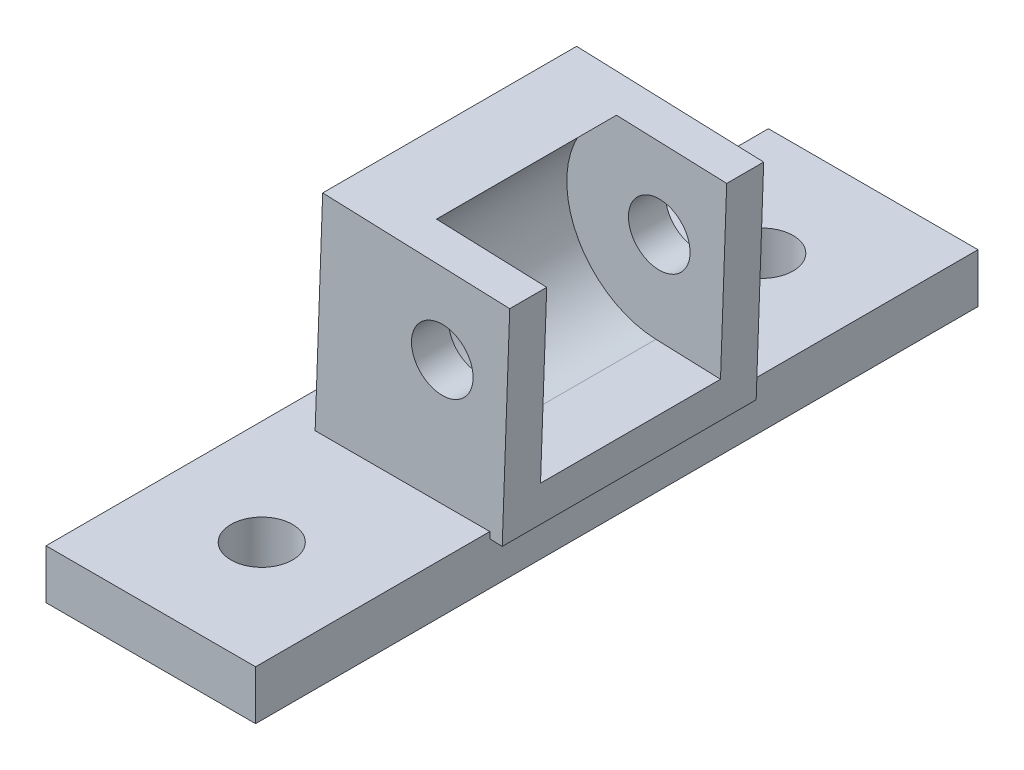
ISO-10303-21;
HEADER;
FILE_DESCRIPTION(('STEP AP214'),'2;1');
FILE_NAME('part.step','',(''),(''),'','','');
FILE_SCHEMA(('AUTOMOTIVE_DESIGN { 1 0 10303 214 1 1 1 1 }'));
ENDSEC;
DATA;
#1=APPLICATION_CONTEXT('core data for automotive mechanical design processes');
#2=APPLICATION_PROTOCOL_DEFINITION('international standard','automotive_design',2000,#1);
#3=PRODUCT_CONTEXT('',#1,'mechanical');
#4=PRODUCT('Part','Part','',(#3));
#5=PRODUCT_RELATED_PRODUCT_CATEGORY('part','',(#4));
#6=PRODUCT_DEFINITION_FORMATION('','',#4);
#7=PRODUCT_DEFINITION_CONTEXT('part definition',#1,'design');
#8=PRODUCT_DEFINITION('design','',#6,#7);
#9=PRODUCT_DEFINITION_SHAPE('','',#8);
#10=(LENGTH_UNIT() NAMED_UNIT(*) SI_UNIT(.MILLI.,.METRE.));
#11=(NAMED_UNIT(*) PLANE_ANGLE_UNIT() SI_UNIT($,.RADIAN.));
#12=(NAMED_UNIT(*) SI_UNIT($,.STERADIAN.) SOLID_ANGLE_UNIT());
#13=UNCERTAINTY_MEASURE_WITH_UNIT(LENGTH_MEASURE(1.E-05),#10,'distance_accuracy_value','');
#14=(GEOMETRIC_REPRESENTATION_CONTEXT(3) GLOBAL_UNCERTAINTY_ASSIGNED_CONTEXT((#13)) GLOBAL_UNIT_ASSIGNED_CONTEXT((#10,
#11,#12)) REPRESENTATION_CONTEXT('',''));
#15=CARTESIAN_POINT('',(0.,0.,0.));
#16=DIRECTION('',(0.,0.,1.));
#17=DIRECTION('',(1.,0.,0.));
#18=AXIS2_PLACEMENT_3D('',#15,#16,#17);
#19=CARTESIAN_POINT('',(3.02025518089412,84.119935624217,-22.352));
#20=DIRECTION('',(-0.035881034865017,-0.999356068344519,0.));
#21=DIRECTION('',(0.999356068344519,-0.035881034865017,0.));
#22=AXIS2_PLACEMENT_3D('',#19,#20,#21);
#23=PLANE('',#22);
#24=DIRECTION('',(0.999356068344519,-0.0358810348650164,0.));
#25=VECTOR('',#24,1.);
#26=CARTESIAN_POINT('',(-359.243555017024,97.1267115029865,3.81));
#27=LINE('',#26,#25);
#28=CARTESIAN_POINT('',(-341.249558268925,96.4806522603092,3.81));
#29=VERTEX_POINT('',#28);
#30=CARTESIAN_POINT('',(-339.972643580323,96.4348057178078,3.81));
#31=VERTEX_POINT('',#30);
#32=EDGE_CURVE('E236',#29,#31,#27,.T.);
#33=ORIENTED_EDGE('',*,*,#32,.F.);
#34=DIRECTION('',(0.,0.,-1.));
#35=VECTOR('',#34,1.);
#36=CARTESIAN_POINT('',(-341.249558268925,96.4806522603092,-22.352));
#37=LINE('',#36,#35);
#38=CARTESIAN_POINT('',(-341.249558268925,96.4806522603092,-22.352));
#39=VERTEX_POINT('',#38);
#40=EDGE_CURVE('E211',#29,#39,#37,.T.);
#41=ORIENTED_EDGE('',*,*,#40,.T.);
#42=DIRECTION('',(0.999356068344519,-0.035881034865017,0.));
#43=VECTOR('',#42,1.);
#44=CARTESIAN_POINT('',(3.02025518089412,84.119935624217,-22.352));
#45=LINE('',#44,#43);
#46=CARTESIAN_POINT('',(-339.972643580323,96.4348057178078,-22.352));
#47=VERTEX_POINT('',#46);
#48=EDGE_CURVE('E286',#39,#47,#45,.T.);
#49=ORIENTED_EDGE('',*,*,#48,.T.);
#50=DIRECTION('',(0.,0.,1.));
#51=VECTOR('',#50,1.);
#52=CARTESIAN_POINT('',(-339.972643580323,96.4348057178078,-22.352));
#53=LINE('',#52,#51);
#54=EDGE_CURVE('E305',#47,#31,#53,.T.);
#55=ORIENTED_EDGE('',*,*,#54,.T.);
#56=EDGE_LOOP('',(#33,#41,#49,#55));
#57=FACE_BOUND('',#56,.T.);
#58=ADVANCED_FACE('F47',(#57),#23,.T.);
#59=CARTESIAN_POINT('',(0.,0.,-22.352));
#60=DIRECTION('',(0.,0.,1.));
#61=DIRECTION('',(1.,0.,0.));
#62=AXIS2_PLACEMENT_3D('',#59,#60,#61);
#63=PLANE('',#62);
#64=CARTESIAN_POINT('',(-346.144684744017,110.000000000002,-22.352));
#65=DIRECTION('',(0.,0.,-1.));
#66=DIRECTION('',(-1.,0.,0.));
#67=AXIS2_PLACEMENT_3D('',#64,#65,#66);
#68=CIRCLE('',#67,3.17499999993891);
#69=CARTESIAN_POINT('',(-349.319684743956,110.000000000002,-22.352));
#70=VERTEX_POINT('',#69);
#71=EDGE_CURVE('E251',#70,#70,#68,.T.);
#72=ORIENTED_EDGE('',*,*,#71,.F.);
#73=EDGE_LOOP('',(#72));
#74=FACE_BOUND('',#73,.T.);
#75=DIRECTION('',(0.,-1.,0.));
#76=VECTOR('',#75,1.);
#77=CARTESIAN_POINT('',(-341.249558268925,0.,-22.352));
#78=LINE('',#77,#76);
#79=CARTESIAN_POINT('',(-341.249558268925,97.1267115029864,-22.352));
#80=VERTEX_POINT('',#79);
#81=EDGE_CURVE('E215',#80,#39,#78,.T.);
#82=ORIENTED_EDGE('',*,*,#81,.F.);
#83=DIRECTION('',(1.,0.,0.));
#84=VECTOR('',#83,1.);
#85=CARTESIAN_POINT('',(0.,97.1267115029864,-22.352));
#86=LINE('',#85,#84);
#87=CARTESIAN_POINT('',(-359.243555017024,97.1267115029864,-22.352));
#88=VERTEX_POINT('',#87);
#89=EDGE_CURVE('E203',#88,#80,#86,.T.);
#90=ORIENTED_EDGE('',*,*,#89,.F.);
#91=DIRECTION('',(-0.035881034865018,-0.999356068344519,0.));
#92=VECTOR('',#91,1.);
#93=CARTESIAN_POINT('',(-362.263810197919,13.0067758787699,-22.352));
#94=LINE('',#93,#92);
#95=CARTESIAN_POINT('',(-358.467972096003,118.728192662681,-22.352));
#96=VERTEX_POINT('',#95);
#97=EDGE_CURVE('E281',#96,#88,#94,.T.);
#98=ORIENTED_EDGE('',*,*,#97,.F.);
#99=DIRECTION('',(-0.999356068344519,0.0358810348650171,0.));
#100=VECTOR('',#99,1.);
#101=CARTESIAN_POINT('',(3.79583810191542,105.721416783911,-22.352));
#102=LINE('',#101,#100);
#103=CARTESIAN_POINT('',(-339.197060659301,118.036286877502,-22.352));
#104=VERTEX_POINT('',#103);
#105=EDGE_CURVE('E277',#104,#96,#102,.T.);
#106=ORIENTED_EDGE('',*,*,#105,.F.);
#107=DIRECTION('',(0.0358810348650155,0.999356068344519,0.));
#108=VECTOR('',#107,1.);
#109=CARTESIAN_POINT('',(-342.992898761217,12.3148700935903,-22.352));
#110=LINE('',#109,#108);
#111=EDGE_CURVE('E289',#47,#104,#110,.T.);
#112=ORIENTED_EDGE('',*,*,#111,.F.);
#113=ORIENTED_EDGE('',*,*,#48,.F.);
#114=EDGE_LOOP('',(#82,#90,#98,#106,#112,#113));
#115=FACE_BOUND('',#114,.T.);
#116=ADVANCED_FACE('F349',(#74,#115),#63,.F.);
#117=CARTESIAN_POINT('',(0.,0.,3.81));
#118=DIRECTION('',(0.,0.,1.));
#119=DIRECTION('',(1.,0.,0.));
#120=AXIS2_PLACEMENT_3D('',#117,#118,#119);
#121=PLANE('',#120);
#122=CARTESIAN_POINT('',(-346.144684744017,110.000000000002,3.81));
#123=DIRECTION('',(0.,0.,-1.));
#124=DIRECTION('',(-1.,0.,0.));
#125=AXIS2_PLACEMENT_3D('',#122,#123,#124);
#126=CIRCLE('',#125,3.17499999993891);
#127=CARTESIAN_POINT('',(-349.319684743956,110.000000000002,3.81));
#128=VERTEX_POINT('',#127);
#129=EDGE_CURVE('E219',#128,#128,#126,.T.);
#130=ORIENTED_EDGE('',*,*,#129,.T.);
#131=EDGE_LOOP('',(#130));
#132=FACE_BOUND('',#131,.T.);
#133=DIRECTION('',(1.,0.,0.));
#134=VECTOR('',#133,1.);
#135=CARTESIAN_POINT('',(0.,97.1267115029865,3.81));
#136=LINE('',#135,#134);
#137=CARTESIAN_POINT('',(-359.243555017024,97.1267115029865,3.81));
#138=VERTEX_POINT('',#137);
#139=CARTESIAN_POINT('',(-341.249558268925,97.1267115029865,3.81));
#140=VERTEX_POINT('',#139);
#141=EDGE_CURVE('E57',#138,#140,#136,.T.);
#142=ORIENTED_EDGE('',*,*,#141,.T.);
#143=DIRECTION('',(0.,-1.,0.));
#144=VECTOR('',#143,1.);
#145=CARTESIAN_POINT('',(-341.249558268925,0.,3.81));
#146=LINE('',#145,#144);
#147=EDGE_CURVE('E11',#140,#29,#146,.T.);
#148=ORIENTED_EDGE('',*,*,#147,.T.);
#149=ORIENTED_EDGE('',*,*,#32,.T.);
#150=DIRECTION('',(0.0358810348650155,0.999356068344519,0.));
#151=VECTOR('',#150,1.);
#152=CARTESIAN_POINT('',(-339.972643580323,96.4348057178078,3.81));
#153=LINE('',#152,#151);
#154=CARTESIAN_POINT('',(-339.197060659301,118.036286877502,3.81));
#155=VERTEX_POINT('',#154);
#156=EDGE_CURVE('E239',#31,#155,#153,.T.);
#157=ORIENTED_EDGE('',*,*,#156,.T.);
#158=DIRECTION('',(-0.999356068344519,0.0358810348650165,0.));
#159=VECTOR('',#158,1.);
#160=CARTESIAN_POINT('',(-339.197060659301,118.036286877502,3.81));
#161=LINE('',#160,#159);
#162=CARTESIAN_POINT('',(-358.467972096003,118.728192662681,3.81));
#163=VERTEX_POINT('',#162);
#164=EDGE_CURVE('E227',#155,#163,#161,.T.);
#165=ORIENTED_EDGE('',*,*,#164,.T.);
#166=DIRECTION('',(-0.035881034865018,-0.999356068344519,0.));
#167=VECTOR('',#166,1.);
#168=CARTESIAN_POINT('',(-358.467972096003,118.728192662681,3.81));
#169=LINE('',#168,#167);
#170=EDGE_CURVE('E231',#163,#138,#169,.T.);
#171=ORIENTED_EDGE('',*,*,#170,.T.);
#172=EDGE_LOOP('',(#142,#148,#149,#157,#165,#171));
#173=FACE_BOUND('',#172,.T.);
#174=ADVANCED_FACE('F367',(#132,#173),#121,.T.);
#175=CARTESIAN_POINT('',(-346.144684744017,110.000000000002,-22.352));
#176=DIRECTION('',(0.,0.,1.));
#177=DIRECTION('',(1.,0.,0.));
#178=AXIS2_PLACEMENT_3D('',#175,#176,#177);
#179=CYLINDRICAL_SURFACE('',#178,9.525);
#180=CARTESIAN_POINT('',(-346.144684744017,110.000000000002,-18.542));
#181=DIRECTION('',(0.,0.,-1.));
#182=DIRECTION('',(-1.,0.,0.));
#183=AXIS2_PLACEMENT_3D('',#180,#181,#182);
#184=CIRCLE('',#183,9.525);
#185=CARTESIAN_POINT('',(-350.55204884766,118.443978129883,-18.542));
#186=VERTEX_POINT('',#185);
#187=CARTESIAN_POINT('',(-346.486451601106,100.48113344902,-18.542));
#188=VERTEX_POINT('',#187);
#189=EDGE_CURVE('E265',#186,#188,#184,.F.);
#190=ORIENTED_EDGE('',*,*,#189,.F.);
#191=DIRECTION('',(0.,0.,1.));
#192=VECTOR('',#191,1.);
#193=CARTESIAN_POINT('',(-350.55204884766,118.443978129883,-22.352));
#194=LINE('',#193,#192);
#195=CARTESIAN_POINT('',(-350.55204884766,118.443978129883,0.));
#196=VERTEX_POINT('',#195);
#197=EDGE_CURVE('E293',#186,#196,#194,.T.);
#198=ORIENTED_EDGE('',*,*,#197,.T.);
#199=CARTESIAN_POINT('',(-346.144684744017,110.000000000002,0.));
#200=DIRECTION('',(0.,0.,1.));
#201=DIRECTION('',(1.,0.,0.));
#202=AXIS2_PLACEMENT_3D('',#199,#200,#201);
#203=CIRCLE('',#202,9.525);
#204=CARTESIAN_POINT('',(-346.486451601106,100.48113344902,0.));
#205=VERTEX_POINT('',#204);
#206=EDGE_CURVE('E276',#196,#205,#203,.T.);
#207=ORIENTED_EDGE('',*,*,#206,.T.);
#208=DIRECTION('',(0.,0.,1.));
#209=VECTOR('',#208,1.);
#210=CARTESIAN_POINT('',(-346.486451601106,100.48113344902,-22.352));
#211=LINE('',#210,#209);
#212=EDGE_CURVE('E299',#188,#205,#211,.T.);
#213=ORIENTED_EDGE('',*,*,#212,.F.);
#214=EDGE_LOOP('',(#190,#198,#207,#213));
#215=FACE_BOUND('',#214,.T.);
#216=ADVANCED_FACE('F49',(#215),#179,.F.);
#217=CARTESIAN_POINT('',(3.15696192372972,87.9274822446101,-22.352));
#218=DIRECTION('',(0.0358810348650154,0.999356068344519,0.));
#219=DIRECTION('',(-0.999356068344519,0.0358810348650154,0.));
#220=AXIS2_PLACEMENT_3D('',#217,#218,#219);
#221=PLANE('',#220);
#222=DIRECTION('',(0.,0.,1.));
#223=VECTOR('',#222,1.);
#224=CARTESIAN_POINT('',(-339.835936837487,100.2423523382,-22.352));
#225=LINE('',#224,#223);
#226=CARTESIAN_POINT('',(-339.835936837487,100.2423523382,-18.542));
#227=VERTEX_POINT('',#226);
#228=CARTESIAN_POINT('',(-339.835936837487,100.2423523382,0.));
#229=VERTEX_POINT('',#228);
#230=EDGE_CURVE('E302',#227,#229,#225,.T.);
#231=ORIENTED_EDGE('',*,*,#230,.F.);
#232=DIRECTION('',(0.999356068344519,-0.0358810348650154,0.));
#233=VECTOR('',#232,1.);
#234=CARTESIAN_POINT('',(3.15696192372972,87.9274822446101,-18.542));
#235=LINE('',#234,#233);
#236=EDGE_CURVE('E73',#188,#227,#235,.T.);
#237=ORIENTED_EDGE('',*,*,#236,.F.);
#238=ORIENTED_EDGE('',*,*,#212,.T.);
#239=DIRECTION('',(-0.999356068344519,0.0358810348650154,0.));
#240=VECTOR('',#239,1.);
#241=CARTESIAN_POINT('',(3.15696192372972,87.9274822446101,0.));
#242=LINE('',#241,#240);
#243=EDGE_CURVE('E282',#229,#205,#242,.T.);
#244=ORIENTED_EDGE('',*,*,#243,.F.);
#245=EDGE_LOOP('',(#231,#237,#238,#244));
#246=FACE_BOUND('',#245,.T.);
#247=ADVANCED_FACE('F376',(#246),#221,.T.);
#248=CARTESIAN_POINT('',(-342.992898761217,12.3148700935903,-22.352));
#249=DIRECTION('',(0.999356068344519,-0.0358810348650155,0.));
#250=DIRECTION('',(0.0358810348650155,0.999356068344519,0.));
#251=AXIS2_PLACEMENT_3D('',#248,#249,#250);
#252=PLANE('',#251);
#253=ORIENTED_EDGE('',*,*,#230,.T.);
#254=DIRECTION('',(0.0358810348650155,0.999356068344519,0.));
#255=VECTOR('',#254,1.);
#256=CARTESIAN_POINT('',(-339.972643580323,96.4348057178078,0.));
#257=LINE('',#256,#255);
#258=CARTESIAN_POINT('',(-339.197060659301,118.036286877502,0.));
#259=VERTEX_POINT('',#258);
#260=EDGE_CURVE('E232',#229,#259,#257,.T.);
#261=ORIENTED_EDGE('',*,*,#260,.T.);
#262=DIRECTION('',(0.,0.,-1.));
#263=VECTOR('',#262,1.);
#264=CARTESIAN_POINT('',(-339.197060659301,118.036286877502,3.81));
#265=LINE('',#264,#263);
#266=EDGE_CURVE('E242',#155,#259,#265,.T.);
#267=ORIENTED_EDGE('',*,*,#266,.F.);
#268=ORIENTED_EDGE('',*,*,#156,.F.);
#269=ORIENTED_EDGE('',*,*,#54,.F.);
#270=ORIENTED_EDGE('',*,*,#111,.T.);
#271=DIRECTION('',(0.,0.,-1.));
#272=VECTOR('',#271,1.);
#273=CARTESIAN_POINT('',(-339.197060659301,118.036286877502,-18.542));
#274=LINE('',#273,#272);
#275=CARTESIAN_POINT('',(-339.197060659301,118.036286877502,-18.542));
#276=VERTEX_POINT('',#275);
#277=EDGE_CURVE('E269',#276,#104,#274,.T.);
#278=ORIENTED_EDGE('',*,*,#277,.F.);
#279=DIRECTION('',(0.0358810348650155,0.999356068344519,0.));
#280=VECTOR('',#279,1.);
#281=CARTESIAN_POINT('',(-342.992898761217,12.3148700935903,-18.542));
#282=LINE('',#281,#280);
#283=EDGE_CURVE('E260',#227,#276,#282,.T.);
#284=ORIENTED_EDGE('',*,*,#283,.F.);
#285=EDGE_LOOP('',(#253,#261,#267,#268,#269,#270,#278,#284));
#286=FACE_BOUND('',#285,.T.);
#287=ADVANCED_FACE('F360',(#286),#252,.T.);
#288=CARTESIAN_POINT('',(-362.263810197919,13.0067758787699,-22.352));
#289=DIRECTION('',(-0.999356068344519,0.035881034865018,0.));
#290=DIRECTION('',(-0.035881034865018,-0.999356068344519,0.));
#291=AXIS2_PLACEMENT_3D('',#288,#289,#290);
#292=PLANE('',#291);
#293=DIRECTION('',(0.,0.,1.));
#294=VECTOR('',#293,1.);
#295=CARTESIAN_POINT('',(-359.243555017024,97.1267115029865,-22.352));
#296=LINE('',#295,#294);
#297=EDGE_CURVE('E309',#88,#138,#296,.T.);
#298=ORIENTED_EDGE('',*,*,#297,.T.);
#299=ORIENTED_EDGE('',*,*,#170,.F.);
#300=DIRECTION('',(0.,0.,1.));
#301=VECTOR('',#300,1.);
#302=CARTESIAN_POINT('',(-358.467972096003,118.728192662681,-22.352));
#303=LINE('',#302,#301);
#304=EDGE_CURVE('E313',#96,#163,#303,.T.);
#305=ORIENTED_EDGE('',*,*,#304,.F.);
#306=ORIENTED_EDGE('',*,*,#97,.T.);
#307=EDGE_LOOP('',(#298,#299,#305,#306));
#308=FACE_BOUND('',#307,.T.);
#309=ADVANCED_FACE('F351',(#308),#292,.T.);
#310=CARTESIAN_POINT('',(3.79583810191542,105.721416783911,-22.352));
#311=DIRECTION('',(0.0358810348650171,0.999356068344519,0.));
#312=DIRECTION('',(-0.999356068344519,0.0358810348650171,0.));
#313=AXIS2_PLACEMENT_3D('',#310,#311,#312);
#314=PLANE('',#313);
#315=ORIENTED_EDGE('',*,*,#304,.T.);
#316=ORIENTED_EDGE('',*,*,#164,.F.);
#317=ORIENTED_EDGE('',*,*,#266,.T.);
#318=DIRECTION('',(-0.999356068344519,0.0358810348650165,0.));
#319=VECTOR('',#318,1.);
#320=CARTESIAN_POINT('',(-339.197060659301,118.036286877502,0.));
#321=LINE('',#320,#319);
#322=EDGE_CURVE('E223',#259,#196,#321,.T.);
#323=ORIENTED_EDGE('',*,*,#322,.T.);
#324=ORIENTED_EDGE('',*,*,#197,.F.);
#325=DIRECTION('',(-0.999356068344519,0.0358810348650165,0.));
#326=VECTOR('',#325,1.);
#327=CARTESIAN_POINT('',(3.79583810191537,105.721416783911,-18.542));
#328=LINE('',#327,#326);
#329=EDGE_CURVE('E256',#276,#186,#328,.T.);
#330=ORIENTED_EDGE('',*,*,#329,.F.);
#331=ORIENTED_EDGE('',*,*,#277,.T.);
#332=ORIENTED_EDGE('',*,*,#105,.T.);
#333=EDGE_LOOP('',(#315,#316,#317,#323,#324,#330,#331,#332));
#334=FACE_BOUND('',#333,.T.);
#335=ADVANCED_FACE('F354',(#334),#314,.T.);
#336=CARTESIAN_POINT('',(-346.144684744017,110.000000000002,-18.542));
#337=DIRECTION('',(0.,0.,-1.));
#338=DIRECTION('',(-1.,0.,0.));
#339=AXIS2_PLACEMENT_3D('',#336,#337,#338);
#340=CYLINDRICAL_SURFACE('',#339,3.17499999993891);
#341=CARTESIAN_POINT('',(-346.144684744017,110.000000000002,-18.542));
#342=DIRECTION('',(0.,0.,-1.));
#343=DIRECTION('',(-1.,0.,0.));
#344=AXIS2_PLACEMENT_3D('',#341,#342,#343);
#345=CIRCLE('',#344,3.17499999993891);
#346=CARTESIAN_POINT('',(-349.319684743956,110.000000000002,-18.542));
#347=VERTEX_POINT('',#346);
#348=EDGE_CURVE('E252',#347,#347,#345,.T.);
#349=CARTESIAN_POINT('',(-349.319684743956,110.000000000002,-18.542));
#350=CARTESIAN_POINT('',(-349.319684743956,110.000000000002,-18.5816875));
#351=CARTESIAN_POINT('',(-349.319684743956,110.000000000002,-18.621375));
#352=CARTESIAN_POINT('',(-349.319684743956,110.000000000002,-18.70075));
#353=CARTESIAN_POINT('',(-349.319684743956,110.000000000002,-18.7404375));
#354=CARTESIAN_POINT('',(-349.319684743956,110.000000000002,-18.8198125));
#355=CARTESIAN_POINT('',(-349.319684743956,110.000000000002,-18.8595));
#356=CARTESIAN_POINT('',(-349.319684743956,110.000000000002,-18.938875));
#357=CARTESIAN_POINT('',(-349.319684743956,110.000000000002,-18.9785625));
#358=CARTESIAN_POINT('',(-349.319684743956,110.000000000002,-19.0579375));
#359=CARTESIAN_POINT('',(-349.319684743956,110.000000000002,-19.097625));
#360=CARTESIAN_POINT('',(-349.319684743956,110.000000000002,-19.177));
#361=CARTESIAN_POINT('',(-349.319684743956,110.000000000002,-19.2166875));
#362=CARTESIAN_POINT('',(-349.319684743956,110.000000000002,-19.2960625));
#363=CARTESIAN_POINT('',(-349.319684743956,110.000000000002,-19.33575));
#364=CARTESIAN_POINT('',(-349.319684743956,110.000000000002,-19.415125));
#365=CARTESIAN_POINT('',(-349.319684743956,110.000000000002,-19.4548125));
#366=CARTESIAN_POINT('',(-349.319684743956,110.000000000002,-19.5341875));
#367=CARTESIAN_POINT('',(-349.319684743956,110.000000000002,-19.573875));
#368=CARTESIAN_POINT('',(-349.319684743956,110.000000000002,-19.65325));
#369=CARTESIAN_POINT('',(-349.319684743956,110.000000000002,-19.6929375));
#370=CARTESIAN_POINT('',(-349.319684743956,110.000000000002,-19.7723125));
#371=CARTESIAN_POINT('',(-349.319684743956,110.000000000002,-19.812));
#372=CARTESIAN_POINT('',(-349.319684743956,110.000000000002,-19.891375));
#373=CARTESIAN_POINT('',(-349.319684743956,110.000000000002,-19.9310625));
#374=CARTESIAN_POINT('',(-349.319684743956,110.000000000002,-20.0104375));
#375=CARTESIAN_POINT('',(-349.319684743956,110.000000000002,-20.050125));
#376=CARTESIAN_POINT('',(-349.319684743956,110.000000000002,-20.1295));
#377=CARTESIAN_POINT('',(-349.319684743956,110.000000000002,-20.1691875));
#378=CARTESIAN_POINT('',(-349.319684743956,110.000000000002,-20.2485625));
#379=CARTESIAN_POINT('',(-349.319684743956,110.000000000002,-20.28825));
#380=CARTESIAN_POINT('',(-349.319684743956,110.000000000002,-20.367625));
#381=CARTESIAN_POINT('',(-349.319684743956,110.000000000002,-20.4073125));
#382=CARTESIAN_POINT('',(-349.319684743956,110.000000000002,-20.4866875));
#383=CARTESIAN_POINT('',(-349.319684743956,110.000000000002,-20.526375));
#384=CARTESIAN_POINT('',(-349.319684743956,110.000000000002,-20.60575));
#385=CARTESIAN_POINT('',(-349.319684743956,110.000000000002,-20.6454375));
#386=CARTESIAN_POINT('',(-349.319684743956,110.000000000002,-20.7248125));
#387=CARTESIAN_POINT('',(-349.319684743956,110.000000000002,-20.7645));
#388=CARTESIAN_POINT('',(-349.319684743956,110.000000000002,-20.843875));
#389=CARTESIAN_POINT('',(-349.319684743956,110.000000000002,-20.8835625));
#390=CARTESIAN_POINT('',(-349.319684743956,110.000000000002,-20.9629375));
#391=CARTESIAN_POINT('',(-349.319684743956,110.000000000002,-21.002625));
#392=CARTESIAN_POINT('',(-349.319684743956,110.000000000002,-21.082));
#393=CARTESIAN_POINT('',(-349.319684743956,110.000000000002,-21.1216875));
#394=CARTESIAN_POINT('',(-349.319684743956,110.000000000002,-21.2010625));
#395=CARTESIAN_POINT('',(-349.319684743956,110.000000000002,-21.24075));
#396=CARTESIAN_POINT('',(-349.319684743956,110.000000000002,-21.320125));
#397=CARTESIAN_POINT('',(-349.319684743956,110.000000000002,-21.3598125));
#398=CARTESIAN_POINT('',(-349.319684743956,110.000000000002,-21.4391875));
#399=CARTESIAN_POINT('',(-349.319684743956,110.000000000002,-21.478875));
#400=CARTESIAN_POINT('',(-349.319684743956,110.000000000002,-21.55825));
#401=CARTESIAN_POINT('',(-349.319684743956,110.000000000002,-21.5979375));
#402=CARTESIAN_POINT('',(-349.319684743956,110.000000000002,-21.6773125));
#403=CARTESIAN_POINT('',(-349.319684743956,110.000000000002,-21.717));
#404=CARTESIAN_POINT('',(-349.319684743956,110.000000000002,-21.796375));
#405=CARTESIAN_POINT('',(-349.319684743956,110.000000000002,-21.8360625));
#406=CARTESIAN_POINT('',(-349.319684743956,110.000000000002,-21.9154375));
#407=CARTESIAN_POINT('',(-349.319684743956,110.000000000002,-21.955125));
#408=CARTESIAN_POINT('',(-349.319684743956,110.000000000002,-22.0345));
#409=CARTESIAN_POINT('',(-349.319684743956,110.000000000002,-22.0741875));
#410=CARTESIAN_POINT('',(-349.319684743956,110.000000000002,-22.1535625));
#411=CARTESIAN_POINT('',(-349.319684743956,110.000000000002,-22.19325));
#412=CARTESIAN_POINT('',(-349.319684743956,110.000000000002,-22.272625));
#413=CARTESIAN_POINT('',(-349.319684743956,110.000000000002,-22.3123125));
#414=CARTESIAN_POINT('',(-349.319684743956,110.000000000002,-22.352));
#415=B_SPLINE_CURVE_WITH_KNOTS('',3,(#349,#350,#351,#352,#353,#354,#355,#356,#357,#358,#359,
#360,#361,#362,#363,#364,#365,#366,#367,#368,#369,#370,#371,#372,#373,#374,#375,#376,#377,#378,
#379,#380,#381,#382,#383,#384,#385,#386,#387,#388,#389,#390,#391,#392,#393,#394,#395,#396,#397,
#398,#399,#400,#401,#402,#403,#404,#405,#406,#407,#408,#409,#410,#411,#412,#413,#414),
.UNSPECIFIED.,.F.,.F.,(4,2,2,2,2,2,2,2,2,2,2,2,2,2,2,2,2,2,2,2,2,2,2,2,2,2,2,2,2,2,2,2,4),(0.,
0.119062500000003,0.238125000000002,0.357187500000002,0.476250000000001,0.5953125,
0.714375000000003,0.833437500000003,0.952500000000002,1.0715625,1.190625,1.3096875,1.42875,
1.5478125,1.666875,1.7859375,1.905,2.0240625,2.143125,2.2621875,2.38125,2.5003125,2.619375,
2.7384375,2.8575,2.9765625,3.095625,3.2146875,3.33375,3.4528125,3.571875,3.6909375,3.81),.UNSPECIFIED.);
#416=EDGE_CURVE('BSEAM380',#347,#70,#415,.T.);
#417=ORIENTED_EDGE('',*,*,#348,.F.);
#418=ORIENTED_EDGE('',*,*,#71,.T.);
#419=ORIENTED_EDGE('',*,*,#416,.T.);
#420=ORIENTED_EDGE('',*,*,#416,.F.);
#421=EDGE_LOOP('',(#417,#419,#418,#420));
#422=FACE_BOUND('',#421,.T.);
#423=ADVANCED_FACE('F380',(#422),#340,.F.);
#424=CARTESIAN_POINT('',(0.,0.,-18.542));
#425=DIRECTION('',(0.,0.,-1.));
#426=DIRECTION('',(-1.,0.,0.));
#427=AXIS2_PLACEMENT_3D('',#424,#425,#426);
#428=PLANE('',#427);
#429=ORIENTED_EDGE('',*,*,#348,.T.);
#430=EDGE_LOOP('',(#429));
#431=FACE_BOUND('',#430,.T.);
#432=ORIENTED_EDGE('',*,*,#329,.T.);
#433=ORIENTED_EDGE('',*,*,#189,.T.);
#434=ORIENTED_EDGE('',*,*,#236,.T.);
#435=ORIENTED_EDGE('',*,*,#283,.T.);
#436=EDGE_LOOP('',(#432,#433,#434,#435));
#437=FACE_BOUND('',#436,.T.);
#438=ADVANCED_FACE('F378',(#431,#437),#428,.F.);
#439=CARTESIAN_POINT('',(0.,0.,0.));
#440=DIRECTION('',(0.,0.,1.));
#441=DIRECTION('',(1.,0.,0.));
#442=AXIS2_PLACEMENT_3D('',#439,#440,#441);
#443=PLANE('',#442);
#444=CARTESIAN_POINT('',(-346.144684744017,110.000000000002,0.));
#445=DIRECTION('',(0.,0.,-1.));
#446=DIRECTION('',(-1.,0.,0.));
#447=AXIS2_PLACEMENT_3D('',#444,#445,#446);
#448=CIRCLE('',#447,3.17499999993891);
#449=CARTESIAN_POINT('',(-349.319684743956,110.000000000002,0.));
#450=VERTEX_POINT('',#449);
#451=EDGE_CURVE('E218',#450,#450,#448,.T.);
#452=ORIENTED_EDGE('',*,*,#451,.F.);
#453=EDGE_LOOP('',(#452));
#454=FACE_BOUND('',#453,.T.);
#455=ORIENTED_EDGE('',*,*,#206,.F.);
#456=ORIENTED_EDGE('',*,*,#322,.F.);
#457=ORIENTED_EDGE('',*,*,#260,.F.);
#458=ORIENTED_EDGE('',*,*,#243,.T.);
#459=EDGE_LOOP('',(#455,#456,#457,#458));
#460=FACE_BOUND('',#459,.T.);
#461=ADVANCED_FACE('F373',(#454,#460),#443,.F.);
#462=CARTESIAN_POINT('',(-346.144684744017,110.000000000002,3.81));
#463=DIRECTION('',(0.,0.,-1.));
#464=DIRECTION('',(-1.,0.,0.));
#465=AXIS2_PLACEMENT_3D('',#462,#463,#464);
#466=CYLINDRICAL_SURFACE('',#465,3.17499999993891);
#467=CARTESIAN_POINT('',(-349.319684743956,110.000000000002,3.81));
#468=CARTESIAN_POINT('',(-349.319684743956,110.000000000002,3.7703125));
#469=CARTESIAN_POINT('',(-349.319684743956,110.000000000002,3.730625));
#470=CARTESIAN_POINT('',(-349.319684743956,110.000000000002,3.65125));
#471=CARTESIAN_POINT('',(-349.319684743956,110.000000000002,3.6115625));
#472=CARTESIAN_POINT('',(-349.319684743956,110.000000000002,3.5321875));
#473=CARTESIAN_POINT('',(-349.319684743956,110.000000000002,3.4925));
#474=CARTESIAN_POINT('',(-349.319684743956,110.000000000002,3.413125));
#475=CARTESIAN_POINT('',(-349.319684743956,110.000000000002,3.3734375));
#476=CARTESIAN_POINT('',(-349.319684743956,110.000000000002,3.2940625));
#477=CARTESIAN_POINT('',(-349.319684743956,110.000000000002,3.254375));
#478=CARTESIAN_POINT('',(-349.319684743956,110.000000000002,3.175));
#479=CARTESIAN_POINT('',(-349.319684743956,110.000000000002,3.1353125));
#480=CARTESIAN_POINT('',(-349.319684743956,110.000000000002,3.0559375));
#481=CARTESIAN_POINT('',(-349.319684743956,110.000000000002,3.01625));
#482=CARTESIAN_POINT('',(-349.319684743956,110.000000000002,2.936875));
#483=CARTESIAN_POINT('',(-349.319684743956,110.000000000002,2.8971875));
#484=CARTESIAN_POINT('',(-349.319684743956,110.000000000002,2.8178125));
#485=CARTESIAN_POINT('',(-349.319684743956,110.000000000002,2.778125));
#486=CARTESIAN_POINT('',(-349.319684743956,110.000000000002,2.69875));
#487=CARTESIAN_POINT('',(-349.319684743956,110.000000000002,2.6590625));
#488=CARTESIAN_POINT('',(-349.319684743956,110.000000000002,2.5796875));
#489=CARTESIAN_POINT('',(-349.319684743956,110.000000000002,2.54));
#490=CARTESIAN_POINT('',(-349.319684743956,110.000000000002,2.460625));
#491=CARTESIAN_POINT('',(-349.319684743956,110.000000000002,2.4209375));
#492=CARTESIAN_POINT('',(-349.319684743956,110.000000000002,2.3415625));
#493=CARTESIAN_POINT('',(-349.319684743956,110.000000000002,2.301875));
#494=CARTESIAN_POINT('',(-349.319684743956,110.000000000002,2.2225));
#495=CARTESIAN_POINT('',(-349.319684743956,110.000000000002,2.1828125));
#496=CARTESIAN_POINT('',(-349.319684743956,110.000000000002,2.1034375));
#497=CARTESIAN_POINT('',(-349.319684743956,110.000000000002,2.06375));
#498=CARTESIAN_POINT('',(-349.319684743956,110.000000000002,1.984375));
#499=CARTESIAN_POINT('',(-349.319684743956,110.000000000002,1.9446875));
#500=CARTESIAN_POINT('',(-349.319684743956,110.000000000002,1.8653125));
#501=CARTESIAN_POINT('',(-349.319684743956,110.000000000002,1.825625));
#502=CARTESIAN_POINT('',(-349.319684743956,110.000000000002,1.74625));
#503=CARTESIAN_POINT('',(-349.319684743956,110.000000000002,1.7065625));
#504=CARTESIAN_POINT('',(-349.319684743956,110.000000000002,1.6271875));
#505=CARTESIAN_POINT('',(-349.319684743956,110.000000000002,1.5875));
#506=CARTESIAN_POINT('',(-349.319684743956,110.000000000002,1.508125));
#507=CARTESIAN_POINT('',(-349.319684743956,110.000000000002,1.4684375));
#508=CARTESIAN_POINT('',(-349.319684743956,110.000000000002,1.3890625));
#509=CARTESIAN_POINT('',(-349.319684743956,110.000000000002,1.349375));
#510=CARTESIAN_POINT('',(-349.319684743956,110.000000000002,1.27));
#511=CARTESIAN_POINT('',(-349.319684743956,110.000000000002,1.2303125));
#512=CARTESIAN_POINT('',(-349.319684743956,110.000000000002,1.1509375));
#513=CARTESIAN_POINT('',(-349.319684743956,110.000000000002,1.11125));
#514=CARTESIAN_POINT('',(-349.319684743956,110.000000000002,1.031875));
#515=CARTESIAN_POINT('',(-349.319684743956,110.000000000002,0.9921875));
#516=CARTESIAN_POINT('',(-349.319684743956,110.000000000002,0.9128125));
#517=CARTESIAN_POINT('',(-349.319684743956,110.000000000002,0.873125));
#518=CARTESIAN_POINT('',(-349.319684743956,110.000000000002,0.79375));
#519=CARTESIAN_POINT('',(-349.319684743956,110.000000000002,0.7540625));
#520=CARTESIAN_POINT('',(-349.319684743956,110.000000000002,0.6746875));
#521=CARTESIAN_POINT('',(-349.319684743956,110.000000000002,0.635));
#522=CARTESIAN_POINT('',(-349.319684743956,110.000000000002,0.555625));
#523=CARTESIAN_POINT('',(-349.319684743956,110.000000000002,0.5159375));
#524=CARTESIAN_POINT('',(-349.319684743956,110.000000000002,0.4365625));
#525=CARTESIAN_POINT('',(-349.319684743956,110.000000000002,0.396875));
#526=CARTESIAN_POINT('',(-349.319684743956,110.000000000002,0.3175));
#527=CARTESIAN_POINT('',(-349.319684743956,110.000000000002,0.2778125));
#528=CARTESIAN_POINT('',(-349.319684743956,110.000000000002,0.1984375));
#529=CARTESIAN_POINT('',(-349.319684743956,110.000000000002,0.15875));
#530=CARTESIAN_POINT('',(-349.319684743956,110.000000000002,0.0793749999999999));
#531=CARTESIAN_POINT('',(-349.319684743956,110.000000000002,0.0396874999999999));
#532=CARTESIAN_POINT('',(-349.319684743956,110.000000000002,0.));
#533=B_SPLINE_CURVE_WITH_KNOTS('',3,(#467,#468,#469,#470,#471,#472,#473,#474,#475,#476,#477,
#478,#479,#480,#481,#482,#483,#484,#485,#486,#487,#488,#489,#490,#491,#492,#493,#494,#495,#496,
#497,#498,#499,#500,#501,#502,#503,#504,#505,#506,#507,#508,#509,#510,#511,#512,#513,#514,#515,
#516,#517,#518,#519,#520,#521,#522,#523,#524,#525,#526,#527,#528,#529,#530,#531,#532),
.UNSPECIFIED.,.F.,.F.,(4,2,2,2,2,2,2,2,2,2,2,2,2,2,2,2,2,2,2,2,2,2,2,2,2,2,2,2,2,2,2,2,4),(0.,
0.1190625,0.238125,0.3571875,0.47625,0.5953125,0.714375,0.833437499999999,0.9525,1.0715625,
1.190625,1.3096875,1.42875,1.5478125,1.666875,1.7859375,1.905,2.0240625,2.143125,2.2621875,
2.38125,2.5003125,2.619375,2.7384375,2.8575,2.9765625,3.095625,3.2146875,3.33375,3.4528125,
3.571875,3.6909375,3.81),.UNSPECIFIED.);
#534=EDGE_CURVE('BSEAM388',#128,#450,#533,.T.);
#535=ORIENTED_EDGE('',*,*,#129,.F.);
#536=ORIENTED_EDGE('',*,*,#451,.T.);
#537=ORIENTED_EDGE('',*,*,#534,.T.);
#538=ORIENTED_EDGE('',*,*,#534,.F.);
#539=EDGE_LOOP('',(#535,#537,#536,#538));
#540=FACE_BOUND('',#539,.T.);
#541=ADVANCED_FACE('F388',(#540),#466,.F.);
#542=CARTESIAN_POINT('',(-341.249558268925,92.0467115029864,-46.482));
#543=DIRECTION('',(-1.,0.,0.));
#544=DIRECTION('',(0.,-1.,0.));
#545=AXIS2_PLACEMENT_3D('',#542,#543,#544);
#546=PLANE('',#545);
#547=DIRECTION('',(0.,0.,1.));
#548=VECTOR('',#547,1.);
#549=CARTESIAN_POINT('',(-341.249558268925,97.1267115029864,-46.482));
#550=LINE('',#549,#548);
#551=CARTESIAN_POINT('',(-341.249558268925,97.1267115029864,-46.482));
#552=VERTEX_POINT('',#551);
#553=EDGE_CURVE('E196',#552,#80,#550,.T.);
#554=ORIENTED_EDGE('',*,*,#553,.T.);
#555=ORIENTED_EDGE('',*,*,#81,.T.);
#556=ORIENTED_EDGE('',*,*,#40,.F.);
#557=ORIENTED_EDGE('',*,*,#147,.F.);
#558=CARTESIAN_POINT('',(-341.249558268925,97.1267115029865,27.94));
#559=VERTEX_POINT('',#558);
#560=EDGE_CURVE('E65',#140,#559,#550,.T.);
#561=ORIENTED_EDGE('',*,*,#560,.T.);
#562=DIRECTION('',(0.,1.,0.));
#563=VECTOR('',#562,1.);
#564=CARTESIAN_POINT('',(-341.249558268925,92.0467115029865,27.94));
#565=LINE('',#564,#563);
#566=CARTESIAN_POINT('',(-341.249558268925,92.0467115029865,27.94));
#567=VERTEX_POINT('',#566);
#568=EDGE_CURVE('E167',#567,#559,#565,.T.);
#569=ORIENTED_EDGE('',*,*,#568,.F.);
#570=DIRECTION('',(0.,0.,1.));
#571=VECTOR('',#570,1.);
#572=CARTESIAN_POINT('',(-341.249558268925,92.0467115029864,-46.482));
#573=LINE('',#572,#571);
#574=CARTESIAN_POINT('',(-341.249558268925,92.0467115029864,-46.482));
#575=VERTEX_POINT('',#574);
#576=EDGE_CURVE('E152',#575,#567,#573,.T.);
#577=ORIENTED_EDGE('',*,*,#576,.F.);
#578=DIRECTION('',(0.,1.,0.));
#579=VECTOR('',#578,1.);
#580=CARTESIAN_POINT('',(-341.249558268925,92.0467115029864,-46.482));
#581=LINE('',#580,#579);
#582=EDGE_CURVE('E173',#575,#552,#581,.T.);
#583=ORIENTED_EDGE('',*,*,#582,.T.);
#584=EDGE_LOOP('',(#554,#555,#556,#557,#561,#569,#577,#583));
#585=FACE_BOUND('',#584,.T.);
#586=ADVANCED_FACE('F169',(#585),#546,.F.);
#587=CARTESIAN_POINT('',(0.,97.1267115029865,-2.1733958658073E-13));
#588=DIRECTION('',(0.,-1.,0.));
#589=DIRECTION('',(0.,0.,-1.));
#590=AXIS2_PLACEMENT_3D('',#587,#588,#589);
#591=PLANE('',#590);
#592=CARTESIAN_POINT('',(-352.044558268925,97.1267115029865,16.51));
#593=DIRECTION('',(0.,1.,0.));
#594=DIRECTION('',(0.,0.,1.));
#595=AXIS2_PLACEMENT_3D('',#592,#593,#594);
#596=CIRCLE('',#595,3.17499999999997);
#597=CARTESIAN_POINT('',(-352.044558268925,97.1267115029865,19.685));
#598=VERTEX_POINT('',#597);
#599=EDGE_CURVE('E323',#598,#598,#596,.T.);
#600=ORIENTED_EDGE('',*,*,#599,.F.);
#601=EDGE_LOOP('',(#600));
#602=FACE_BOUND('',#601,.T.);
#603=CARTESIAN_POINT('',(-352.044558268925,97.1267115029864,-35.052));
#604=DIRECTION('',(0.,1.,0.));
#605=DIRECTION('',(0.,0.,1.));
#606=AXIS2_PLACEMENT_3D('',#603,#604,#605);
#607=CIRCLE('',#606,3.17499999999997);
#608=CARTESIAN_POINT('',(-352.044558268925,97.1267115029864,-31.877));
#609=VERTEX_POINT('',#608);
#610=EDGE_CURVE('E186',#609,#609,#607,.T.);
#611=ORIENTED_EDGE('',*,*,#610,.F.);
#612=EDGE_LOOP('',(#611));
#613=FACE_BOUND('',#612,.T.);
#614=ORIENTED_EDGE('',*,*,#297,.F.);
#615=ORIENTED_EDGE('',*,*,#89,.T.);
#616=ORIENTED_EDGE('',*,*,#553,.F.);
#617=DIRECTION('',(1.,0.,0.));
#618=VECTOR('',#617,1.);
#619=CARTESIAN_POINT('',(-362.839558268925,97.1267115029864,-46.482));
#620=LINE('',#619,#618);
#621=CARTESIAN_POINT('',(-362.839558268925,97.1267115029864,-46.482));
#622=VERTEX_POINT('',#621);
#623=EDGE_CURVE('E183',#622,#552,#620,.T.);
#624=ORIENTED_EDGE('',*,*,#623,.F.);
#625=DIRECTION('',(0.,0.,1.));
#626=VECTOR('',#625,1.);
#627=CARTESIAN_POINT('',(-362.839558268925,97.1267115029864,-46.482));
#628=LINE('',#627,#626);
#629=CARTESIAN_POINT('',(-362.839558268925,97.1267115029865,27.94));
#630=VERTEX_POINT('',#629);
#631=EDGE_CURVE('E179',#622,#630,#628,.T.);
#632=ORIENTED_EDGE('',*,*,#631,.T.);
#633=DIRECTION('',(1.,0.,0.));
#634=VECTOR('',#633,1.);
#635=CARTESIAN_POINT('',(-362.839558268925,97.1267115029865,27.94));
#636=LINE('',#635,#634);
#637=EDGE_CURVE('E193',#630,#559,#636,.T.);
#638=ORIENTED_EDGE('',*,*,#637,.T.);
#639=ORIENTED_EDGE('',*,*,#560,.F.);
#640=ORIENTED_EDGE('',*,*,#141,.F.);
#641=EDGE_LOOP('',(#614,#615,#616,#624,#632,#638,#639,#640));
#642=FACE_BOUND('',#641,.T.);
#643=ADVANCED_FACE('F338',(#602,#613,#642),#591,.F.);
#644=CARTESIAN_POINT('',(-362.839558268925,92.0467115029865,27.94));
#645=DIRECTION('',(0.,0.,1.));
#646=DIRECTION('',(0.,-1.,0.));
#647=AXIS2_PLACEMENT_3D('',#644,#645,#646);
#648=PLANE('',#647);
#649=ORIENTED_EDGE('',*,*,#637,.F.);
#650=DIRECTION('',(0.,1.,0.));
#651=VECTOR('',#650,1.);
#652=CARTESIAN_POINT('',(-362.839558268925,92.0467115029865,27.94));
#653=LINE('',#652,#651);
#654=CARTESIAN_POINT('',(-362.839558268925,92.0467115029865,27.94));
#655=VERTEX_POINT('',#654);
#656=EDGE_CURVE('E177',#655,#630,#653,.T.);
#657=ORIENTED_EDGE('',*,*,#656,.F.);
#658=DIRECTION('',(1.,0.,0.));
#659=VECTOR('',#658,1.);
#660=CARTESIAN_POINT('',(-362.839558268925,92.0467115029865,27.94));
#661=LINE('',#660,#659);
#662=EDGE_CURVE('E157',#655,#567,#661,.T.);
#663=ORIENTED_EDGE('',*,*,#662,.T.);
#664=ORIENTED_EDGE('',*,*,#568,.T.);
#665=EDGE_LOOP('',(#649,#657,#663,#664));
#666=FACE_BOUND('',#665,.T.);
#667=ADVANCED_FACE('F176',(#666),#648,.T.);
#668=CARTESIAN_POINT('',(-362.839558268925,92.0467115029864,-46.482));
#669=DIRECTION('',(-1.,0.,0.));
#670=DIRECTION('',(0.,-1.,0.));
#671=AXIS2_PLACEMENT_3D('',#668,#669,#670);
#672=PLANE('',#671);
#673=ORIENTED_EDGE('',*,*,#631,.F.);
#674=DIRECTION('',(0.,1.,0.));
#675=VECTOR('',#674,1.);
#676=CARTESIAN_POINT('',(-362.839558268925,92.0467115029864,-46.482));
#677=LINE('',#676,#675);
#678=CARTESIAN_POINT('',(-362.839558268925,92.0467115029864,-46.482));
#679=VERTEX_POINT('',#678);
#680=EDGE_CURVE('E204',#679,#622,#677,.T.);
#681=ORIENTED_EDGE('',*,*,#680,.F.);
#682=DIRECTION('',(0.,0.,1.));
#683=VECTOR('',#682,1.);
#684=CARTESIAN_POINT('',(-362.839558268925,92.0467115029864,-46.482));
#685=LINE('',#684,#683);
#686=EDGE_CURVE('E174',#679,#655,#685,.T.);
#687=ORIENTED_EDGE('',*,*,#686,.T.);
#688=ORIENTED_EDGE('',*,*,#656,.T.);
#689=EDGE_LOOP('',(#673,#681,#687,#688));
#690=FACE_BOUND('',#689,.T.);
#691=ADVANCED_FACE('F474',(#690),#672,.T.);
#692=CARTESIAN_POINT('',(-362.839558268925,92.0467115029864,-46.482));
#693=DIRECTION('',(0.,0.,1.));
#694=DIRECTION('',(0.,-1.,0.));
#695=AXIS2_PLACEMENT_3D('',#692,#693,#694);
#696=PLANE('',#695);
#697=ORIENTED_EDGE('',*,*,#623,.T.);
#698=ORIENTED_EDGE('',*,*,#582,.F.);
#699=DIRECTION('',(1.,0.,0.));
#700=VECTOR('',#699,1.);
#701=CARTESIAN_POINT('',(-362.839558268925,92.0467115029864,-46.482));
#702=LINE('',#701,#700);
#703=EDGE_CURVE('E160',#679,#575,#702,.T.);
#704=ORIENTED_EDGE('',*,*,#703,.F.);
#705=ORIENTED_EDGE('',*,*,#680,.T.);
#706=EDGE_LOOP('',(#697,#698,#704,#705));
#707=FACE_BOUND('',#706,.T.);
#708=ADVANCED_FACE('F483',(#707),#696,.F.);
#709=CARTESIAN_POINT('',(0.,92.0467115029865,-2.05634512925955E-13));
#710=DIRECTION('',(0.,-1.,0.));
#711=DIRECTION('',(0.,0.,-1.));
#712=AXIS2_PLACEMENT_3D('',#709,#710,#711);
#713=PLANE('',#712);
#714=CARTESIAN_POINT('',(-352.044558268925,92.0467115029865,16.51));
#715=DIRECTION('',(0.,-1.,0.));
#716=DIRECTION('',(0.,0.,-1.));
#717=AXIS2_PLACEMENT_3D('',#714,#715,#716);
#718=CIRCLE('',#717,3.17499999999997);
#719=CARTESIAN_POINT('',(-352.044558268925,92.0467115029865,13.335));
#720=VERTEX_POINT('',#719);
#721=EDGE_CURVE('E51',#720,#720,#718,.T.);
#722=ORIENTED_EDGE('',*,*,#721,.F.);
#723=EDGE_LOOP('',(#722));
#724=FACE_BOUND('',#723,.T.);
#725=CARTESIAN_POINT('',(-352.044558268925,92.0467115029864,-35.052));
#726=DIRECTION('',(0.,-1.,0.));
#727=DIRECTION('',(0.,0.,-1.));
#728=AXIS2_PLACEMENT_3D('',#725,#726,#727);
#729=CIRCLE('',#728,3.17499999999997);
#730=CARTESIAN_POINT('',(-352.044558268925,92.0467115029864,-38.2269999999999));
#731=VERTEX_POINT('',#730);
#732=EDGE_CURVE('E320',#731,#731,#729,.T.);
#733=ORIENTED_EDGE('',*,*,#732,.F.);
#734=EDGE_LOOP('',(#733));
#735=FACE_BOUND('',#734,.T.);
#736=ORIENTED_EDGE('',*,*,#662,.F.);
#737=ORIENTED_EDGE('',*,*,#686,.F.);
#738=ORIENTED_EDGE('',*,*,#703,.T.);
#739=ORIENTED_EDGE('',*,*,#576,.T.);
#740=EDGE_LOOP('',(#736,#737,#738,#739));
#741=FACE_BOUND('',#740,.T.);
#742=ADVANCED_FACE('F154',(#724,#735,#741),#713,.T.);
#743=CARTESIAN_POINT('',(-352.044558268925,90.7767115029864,-35.052));
#744=DIRECTION('',(0.,1.,0.));
#745=DIRECTION('',(0.,0.,1.));
#746=AXIS2_PLACEMENT_3D('',#743,#744,#745);
#747=CYLINDRICAL_SURFACE('',#746,3.17499999999997);
#748=ORIENTED_EDGE('',*,*,#732,.T.);
#749=EDGE_LOOP('',(#748));
#750=FACE_BOUND('',#749,.T.);
#751=ORIENTED_EDGE('',*,*,#610,.T.);
#752=EDGE_LOOP('',(#751));
#753=FACE_BOUND('',#752,.T.);
#754=ADVANCED_FACE('F336',(#750,#753),#747,.F.);
#755=CARTESIAN_POINT('',(-352.044558268925,90.7767115029865,16.51));
#756=DIRECTION('',(0.,1.,0.));
#757=DIRECTION('',(0.,0.,1.));
#758=AXIS2_PLACEMENT_3D('',#755,#756,#757);
#759=CYLINDRICAL_SURFACE('',#758,3.17499999999997);
#760=ORIENTED_EDGE('',*,*,#721,.T.);
#761=EDGE_LOOP('',(#760));
#762=FACE_BOUND('',#761,.T.);
#763=ORIENTED_EDGE('',*,*,#599,.T.);
#764=EDGE_LOOP('',(#763));
#765=FACE_BOUND('',#764,.T.);
#766=ADVANCED_FACE('F509',(#762,#765),#759,.F.);
#767=CLOSED_SHELL('',(#58,#116,#174,#216,#247,#287,#309,#335,#423,#438,#461,#541,#586,#643,#667,
#691,#708,#742,#754,#766));
#768=MANIFOLD_SOLID_BREP('B2',#767);
#769=ADVANCED_BREP_SHAPE_REPRESENTATION('',(#18,#768),#14);
#770=SHAPE_DEFINITION_REPRESENTATION(#9,#769);
ENDSEC;
END-ISO-10303-21;
